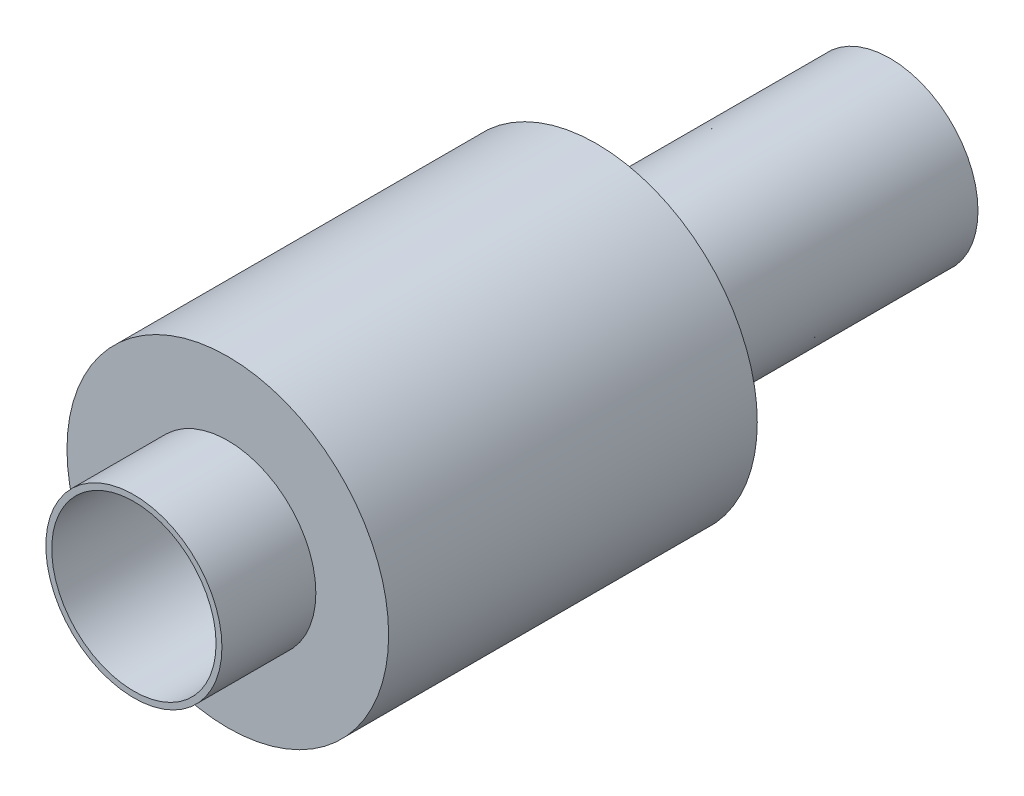
ISO-10303-21;
HEADER;
FILE_DESCRIPTION(('STEP AP214'),'2;1');
FILE_NAME('part.step','',(''),(''),'','','');
FILE_SCHEMA(('AUTOMOTIVE_DESIGN { 1 0 10303 214 1 1 1 1 }'));
ENDSEC;
DATA;
#1=APPLICATION_CONTEXT('core data for automotive mechanical design processes');
#2=APPLICATION_PROTOCOL_DEFINITION('international standard','automotive_design',2000,#1);
#3=PRODUCT_CONTEXT('',#1,'mechanical');
#4=PRODUCT('Part','Part','',(#3));
#5=PRODUCT_RELATED_PRODUCT_CATEGORY('part','',(#4));
#6=PRODUCT_DEFINITION_FORMATION('','',#4);
#7=PRODUCT_DEFINITION_CONTEXT('part definition',#1,'design');
#8=PRODUCT_DEFINITION('design','',#6,#7);
#9=PRODUCT_DEFINITION_SHAPE('','',#8);
#10=(LENGTH_UNIT() NAMED_UNIT(*) SI_UNIT(.MILLI.,.METRE.));
#11=(NAMED_UNIT(*) PLANE_ANGLE_UNIT() SI_UNIT($,.RADIAN.));
#12=(NAMED_UNIT(*) SI_UNIT($,.STERADIAN.) SOLID_ANGLE_UNIT());
#13=UNCERTAINTY_MEASURE_WITH_UNIT(LENGTH_MEASURE(1.E-05),#10,'distance_accuracy_value','');
#14=(GEOMETRIC_REPRESENTATION_CONTEXT(3) GLOBAL_UNCERTAINTY_ASSIGNED_CONTEXT((#13)) GLOBAL_UNIT_ASSIGNED_CONTEXT((#10,
#11,#12)) REPRESENTATION_CONTEXT('',''));
#15=CARTESIAN_POINT('',(0.,0.,0.));
#16=DIRECTION('',(0.,0.,1.));
#17=DIRECTION('',(1.,0.,0.));
#18=AXIS2_PLACEMENT_3D('',#15,#16,#17);
#19=CARTESIAN_POINT('',(0.,0.,0.));
#20=DIRECTION('',(0.,0.,1.));
#21=DIRECTION('',(1.,0.,0.));
#22=AXIS2_PLACEMENT_3D('',#19,#20,#21);
#23=PLANE('',#22);
#24=CARTESIAN_POINT('',(0.,0.,0.));
#25=DIRECTION('',(0.,0.,1.));
#26=DIRECTION('',(1.,0.,0.));
#27=AXIS2_PLACEMENT_3D('',#24,#25,#26);
#28=CIRCLE('',#27,17.399);
#29=CARTESIAN_POINT('',(17.399,0.,0.));
#30=VERTEX_POINT('',#29);
#31=EDGE_CURVE('E41',#30,#30,#28,.T.);
#32=ORIENTED_EDGE('',*,*,#31,.F.);
#33=EDGE_LOOP('',(#32));
#34=FACE_BOUND('',#33,.T.);
#35=CARTESIAN_POINT('',(0.,0.,0.));
#36=DIRECTION('',(0.,0.,1.));
#37=DIRECTION('',(1.,0.,0.));
#38=AXIS2_PLACEMENT_3D('',#35,#36,#37);
#39=CIRCLE('',#38,9.525);
#40=CARTESIAN_POINT('',(9.525,0.,0.));
#41=VERTEX_POINT('',#40);
#42=EDGE_CURVE('E10',#41,#41,#39,.F.);
#43=ORIENTED_EDGE('',*,*,#42,.F.);
#44=EDGE_LOOP('',(#43));
#45=FACE_BOUND('',#44,.T.);
#46=ADVANCED_FACE('F34',(#34,#45),#23,.F.);
#47=CARTESIAN_POINT('',(0.,0.,50.038));
#48=DIRECTION('',(0.,0.,-1.));
#49=DIRECTION('',(-1.,0.,0.));
#50=AXIS2_PLACEMENT_3D('',#47,#48,#49);
#51=CYLINDRICAL_SURFACE('',#50,17.399);
#52=ORIENTED_EDGE('',*,*,#31,.T.);
#53=EDGE_LOOP('',(#52));
#54=FACE_BOUND('',#53,.T.);
#55=CARTESIAN_POINT('',(0.,0.,39.878));
#56=DIRECTION('',(0.,0.,1.));
#57=DIRECTION('',(1.,0.,0.));
#58=AXIS2_PLACEMENT_3D('',#55,#56,#57);
#59=CIRCLE('',#58,17.399);
#60=CARTESIAN_POINT('',(17.399,0.,39.878));
#61=VERTEX_POINT('',#60);
#62=EDGE_CURVE('E45',#61,#61,#59,.T.);
#63=ORIENTED_EDGE('',*,*,#62,.F.);
#64=EDGE_LOOP('',(#63));
#65=FACE_BOUND('',#64,.T.);
#66=ADVANCED_FACE('F36',(#54,#65),#51,.T.);
#67=CARTESIAN_POINT('',(0.,0.,39.878));
#68=DIRECTION('',(0.,0.,1.));
#69=DIRECTION('',(1.,0.,0.));
#70=AXIS2_PLACEMENT_3D('',#67,#68,#69);
#71=PLANE('',#70);
#72=CARTESIAN_POINT('',(0.,0.,39.878));
#73=DIRECTION('',(0.,0.,1.));
#74=DIRECTION('',(1.,0.,0.));
#75=AXIS2_PLACEMENT_3D('',#72,#73,#74);
#76=CIRCLE('',#75,9.525);
#77=CARTESIAN_POINT('',(9.525,0.,39.878));
#78=VERTEX_POINT('',#77);
#79=EDGE_CURVE('E50',#78,#78,#76,.T.);
#80=ORIENTED_EDGE('',*,*,#79,.F.);
#81=EDGE_LOOP('',(#80));
#82=FACE_BOUND('',#81,.T.);
#83=ORIENTED_EDGE('',*,*,#62,.T.);
#84=EDGE_LOOP('',(#83));
#85=FACE_BOUND('',#84,.T.);
#86=ADVANCED_FACE('F88',(#82,#85),#71,.T.);
#87=CARTESIAN_POINT('',(0.,0.,39.878));
#88=DIRECTION('',(0.,0.,1.));
#89=DIRECTION('',(1.,0.,0.));
#90=AXIS2_PLACEMENT_3D('',#87,#88,#89);
#91=CYLINDRICAL_SURFACE('',#90,9.525);
#92=ORIENTED_EDGE('',*,*,#79,.T.);
#93=EDGE_LOOP('',(#92));
#94=FACE_BOUND('',#93,.T.);
#95=CARTESIAN_POINT('',(0.,0.,50.038));
#96=DIRECTION('',(0.,0.,1.));
#97=DIRECTION('',(1.,0.,0.));
#98=AXIS2_PLACEMENT_3D('',#95,#96,#97);
#99=CIRCLE('',#98,9.525);
#100=CARTESIAN_POINT('',(9.525,0.,50.038));
#101=VERTEX_POINT('',#100);
#102=EDGE_CURVE('E52',#101,#101,#99,.T.);
#103=ORIENTED_EDGE('',*,*,#102,.F.);
#104=EDGE_LOOP('',(#103));
#105=FACE_BOUND('',#104,.T.);
#106=ADVANCED_FACE('F93',(#94,#105),#91,.T.);
#107=CARTESIAN_POINT('',(0.,0.,50.038));
#108=DIRECTION('',(0.,0.,1.));
#109=DIRECTION('',(1.,0.,0.));
#110=AXIS2_PLACEMENT_3D('',#107,#108,#109);
#111=PLANE('',#110);
#112=CARTESIAN_POINT('',(0.,0.,50.038));
#113=DIRECTION('',(0.,0.,1.));
#114=DIRECTION('',(1.,0.,0.));
#115=AXIS2_PLACEMENT_3D('',#112,#113,#114);
#116=CIRCLE('',#115,8.89);
#117=CARTESIAN_POINT('',(8.89,0.,50.038));
#118=VERTEX_POINT('',#117);
#119=EDGE_CURVE('E55',#118,#118,#116,.T.);
#120=ORIENTED_EDGE('',*,*,#119,.F.);
#121=EDGE_LOOP('',(#120));
#122=FACE_BOUND('',#121,.T.);
#123=ORIENTED_EDGE('',*,*,#102,.T.);
#124=EDGE_LOOP('',(#123));
#125=FACE_BOUND('',#124,.T.);
#126=ADVANCED_FACE('F80',(#122,#125),#111,.T.);
#127=CARTESIAN_POINT('',(0.,0.,-76.962));
#128=DIRECTION('',(0.,0.,1.));
#129=DIRECTION('',(1.,0.,0.));
#130=AXIS2_PLACEMENT_3D('',#127,#128,#129);
#131=CYLINDRICAL_SURFACE('',#130,8.89);
#132=ORIENTED_EDGE('',*,*,#119,.T.);
#133=EDGE_LOOP('',(#132));
#134=FACE_BOUND('',#133,.T.);
#135=CARTESIAN_POINT('',(0.,0.,-31.75));
#136=DIRECTION('',(0.,0.,-1.));
#137=DIRECTION('',(-1.,0.,0.));
#138=AXIS2_PLACEMENT_3D('',#135,#136,#137);
#139=CIRCLE('',#138,8.89);
#140=CARTESIAN_POINT('',(-8.89,0.,-31.75));
#141=VERTEX_POINT('',#140);
#142=EDGE_CURVE('E63',#141,#141,#139,.T.);
#143=ORIENTED_EDGE('',*,*,#142,.T.);
#144=EDGE_LOOP('',(#143));
#145=FACE_BOUND('',#144,.T.);
#146=ADVANCED_FACE('F67',(#134,#145),#131,.F.);
#147=CARTESIAN_POINT('',(0.,0.,-31.75));
#148=DIRECTION('',(0.,0.,-1.));
#149=DIRECTION('',(-1.,0.,0.));
#150=AXIS2_PLACEMENT_3D('',#147,#148,#149);
#151=PLANE('',#150);
#152=CARTESIAN_POINT('',(0.,0.,-31.75));
#153=DIRECTION('',(0.,0.,-1.));
#154=DIRECTION('',(-1.,0.,0.));
#155=AXIS2_PLACEMENT_3D('',#152,#153,#154);
#156=CIRCLE('',#155,9.525);
#157=CARTESIAN_POINT('',(-9.525,0.,-31.75));
#158=VERTEX_POINT('',#157);
#159=EDGE_CURVE('E60',#158,#158,#156,.T.);
#160=ORIENTED_EDGE('',*,*,#159,.T.);
#161=EDGE_LOOP('',(#160));
#162=FACE_BOUND('',#161,.T.);
#163=ORIENTED_EDGE('',*,*,#142,.F.);
#164=EDGE_LOOP('',(#163));
#165=FACE_BOUND('',#164,.T.);
#166=ADVANCED_FACE('F69',(#162,#165),#151,.T.);
#167=CARTESIAN_POINT('',(0.,0.,-31.75));
#168=DIRECTION('',(0.,0.,1.));
#169=DIRECTION('',(1.,0.,0.));
#170=AXIS2_PLACEMENT_3D('',#167,#168,#169);
#171=CYLINDRICAL_SURFACE('',#170,9.525);
#172=ORIENTED_EDGE('',*,*,#159,.F.);
#173=EDGE_LOOP('',(#172));
#174=FACE_BOUND('',#173,.T.);
#175=ORIENTED_EDGE('',*,*,#42,.T.);
#176=EDGE_LOOP('',(#175));
#177=FACE_BOUND('',#176,.T.);
#178=ADVANCED_FACE('F71',(#174,#177),#171,.T.);
#179=CLOSED_SHELL('',(#46,#66,#86,#106,#126,#146,#166,#178));
#180=MANIFOLD_SOLID_BREP('B2',#179);
#181=ADVANCED_BREP_SHAPE_REPRESENTATION('',(#18,#180),#14);
#182=SHAPE_DEFINITION_REPRESENTATION(#9,#181);
ENDSEC;
END-ISO-10303-21;
